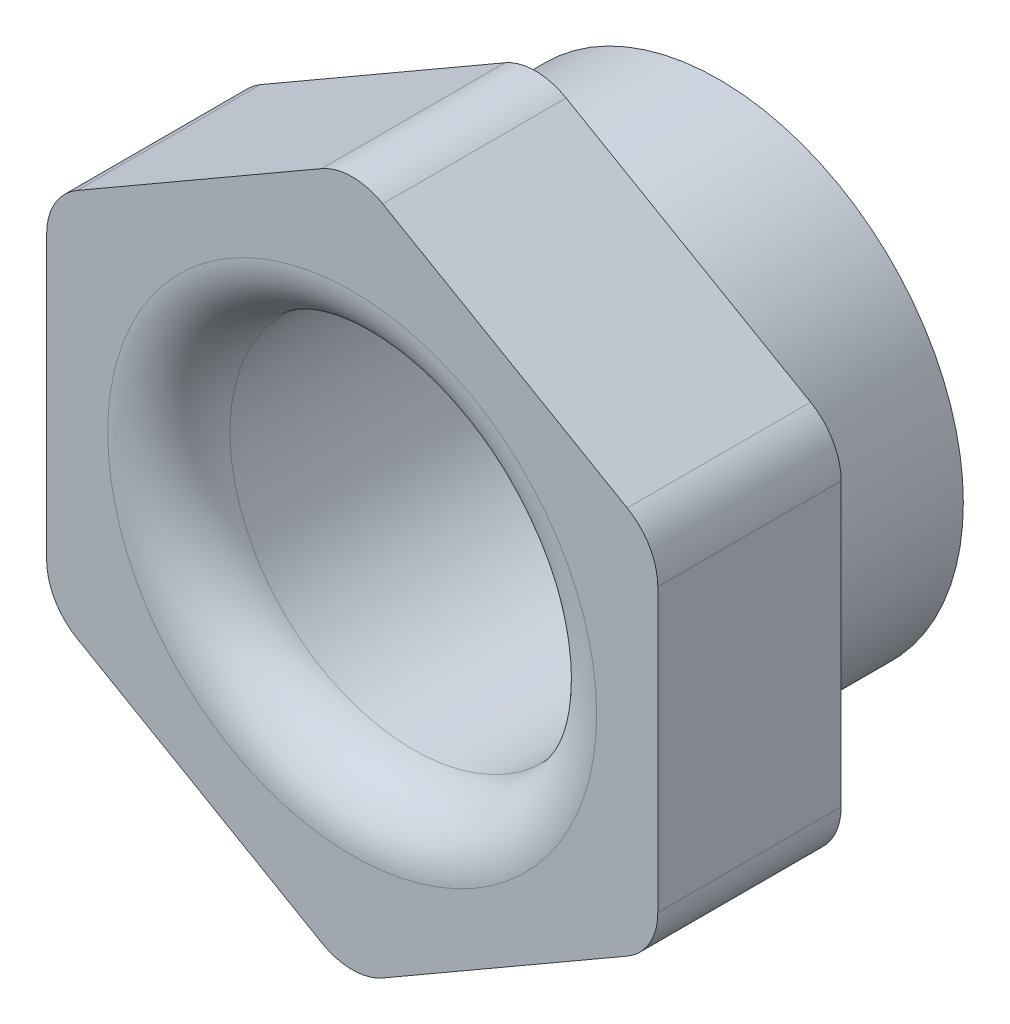
ISO-10303-21;
HEADER;
FILE_DESCRIPTION(('STEP AP214'),'2;1');
FILE_NAME('part.step','',(''),(''),'','','');
FILE_SCHEMA(('AUTOMOTIVE_DESIGN { 1 0 10303 214 1 1 1 1 }'));
ENDSEC;
DATA;
#1=APPLICATION_CONTEXT('core data for automotive mechanical design processes');
#2=APPLICATION_PROTOCOL_DEFINITION('international standard','automotive_design',2000,#1);
#3=PRODUCT_CONTEXT('',#1,'mechanical');
#4=PRODUCT('Part','Part','',(#3));
#5=PRODUCT_RELATED_PRODUCT_CATEGORY('part','',(#4));
#6=PRODUCT_DEFINITION_FORMATION('','',#4);
#7=PRODUCT_DEFINITION_CONTEXT('part definition',#1,'design');
#8=PRODUCT_DEFINITION('design','',#6,#7);
#9=PRODUCT_DEFINITION_SHAPE('','',#8);
#10=(LENGTH_UNIT() NAMED_UNIT(*) SI_UNIT(.MILLI.,.METRE.));
#11=(NAMED_UNIT(*) PLANE_ANGLE_UNIT() SI_UNIT($,.RADIAN.));
#12=(NAMED_UNIT(*) SI_UNIT($,.STERADIAN.) SOLID_ANGLE_UNIT());
#13=UNCERTAINTY_MEASURE_WITH_UNIT(LENGTH_MEASURE(1.E-05),#10,'distance_accuracy_value','');
#14=(GEOMETRIC_REPRESENTATION_CONTEXT(3) GLOBAL_UNCERTAINTY_ASSIGNED_CONTEXT((#13)) GLOBAL_UNIT_ASSIGNED_CONTEXT((#10,
#11,#12)) REPRESENTATION_CONTEXT('',''));
#15=CARTESIAN_POINT('',(0.,0.,0.));
#16=DIRECTION('',(0.,0.,1.));
#17=DIRECTION('',(1.,0.,0.));
#18=AXIS2_PLACEMENT_3D('',#15,#16,#17);
#19=CARTESIAN_POINT('',(2.,1.15470053838,2.25));
#20=DIRECTION('',(0.,0.,1.));
#21=DIRECTION('',(1.,0.,0.));
#22=AXIS2_PLACEMENT_3D('',#19,#20,#21);
#23=CYLINDRICAL_SURFACE('',#22,0.5);
#24=CARTESIAN_POINT('',(2.,1.15470053838,1.5));
#25=DIRECTION('',(0.,0.,1.));
#26=DIRECTION('',(1.,0.,0.));
#27=AXIS2_PLACEMENT_3D('',#24,#25,#26);
#28=CIRCLE('',#27,0.5);
#29=CARTESIAN_POINT('',(2.5,1.15470053838,1.5));
#30=VERTEX_POINT('',#29);
#31=CARTESIAN_POINT('',(2.24999999999848,1.58771324026836,1.5));
#32=VERTEX_POINT('',#31);
#33=EDGE_CURVE('E260',#30,#32,#28,.T.);
#34=ORIENTED_EDGE('',*,*,#33,.T.);
#35=DIRECTION('',(0.,0.,1.));
#36=VECTOR('',#35,1.);
#37=CARTESIAN_POINT('',(2.24999999999891,1.58771324026811,1.5));
#38=LINE('',#37,#36);
#39=CARTESIAN_POINT('',(2.24999999999903,1.5877132402693,3.));
#40=VERTEX_POINT('',#39);
#41=EDGE_CURVE('E119',#40,#32,#38,.F.);
#42=ORIENTED_EDGE('',*,*,#41,.F.);
#43=CARTESIAN_POINT('',(2.,1.15470053838,3.));
#44=DIRECTION('',(0.,0.,1.));
#45=DIRECTION('',(1.,0.,0.));
#46=AXIS2_PLACEMENT_3D('',#43,#44,#45);
#47=CIRCLE('',#46,0.5);
#48=CARTESIAN_POINT('',(2.5,1.15470053838,3.));
#49=VERTEX_POINT('',#48);
#50=EDGE_CURVE('E112',#40,#49,#47,.F.);
#51=ORIENTED_EDGE('',*,*,#50,.T.);
#52=DIRECTION('',(0.,0.,-1.));
#53=VECTOR('',#52,1.);
#54=CARTESIAN_POINT('',(2.5,1.15470053838,1.5));
#55=LINE('',#54,#53);
#56=EDGE_CURVE('E117',#30,#49,#55,.F.);
#57=ORIENTED_EDGE('',*,*,#56,.F.);
#58=EDGE_LOOP('',(#34,#42,#51,#57));
#59=FACE_BOUND('',#58,.T.);
#60=ADVANCED_FACE('F17',(#59),#23,.T.);
#61=CARTESIAN_POINT('',(0.,2.30940107676,2.25));
#62=DIRECTION('',(0.,0.,1.));
#63=DIRECTION('',(1.,0.,0.));
#64=AXIS2_PLACEMENT_3D('',#61,#62,#63);
#65=CYLINDRICAL_SURFACE('',#64,0.5);
#66=CARTESIAN_POINT('',(0.,2.30940107676,1.5));
#67=DIRECTION('',(0.,0.,1.));
#68=DIRECTION('',(1.,0.,0.));
#69=AXIS2_PLACEMENT_3D('',#66,#67,#68);
#70=CIRCLE('',#69,0.5);
#71=CARTESIAN_POINT('',(0.249999999998405,2.74241377864824,1.5));
#72=VERTEX_POINT('',#71);
#73=CARTESIAN_POINT('',(-0.250000000000659,2.74241377865214,1.5));
#74=VERTEX_POINT('',#73);
#75=EDGE_CURVE('E258',#72,#74,#70,.T.);
#76=ORIENTED_EDGE('',*,*,#75,.T.);
#77=DIRECTION('',(0.,0.,1.));
#78=VECTOR('',#77,1.);
#79=CARTESIAN_POINT('',(-0.250000000001091,2.74241377865189,1.5));
#80=LINE('',#79,#78);
#81=CARTESIAN_POINT('',(-0.250000000000126,2.74241377865119,3.));
#82=VERTEX_POINT('',#81);
#83=EDGE_CURVE('E212',#82,#74,#80,.F.);
#84=ORIENTED_EDGE('',*,*,#83,.F.);
#85=CARTESIAN_POINT('',(0.,2.30940107676,3.));
#86=DIRECTION('',(0.,0.,1.));
#87=DIRECTION('',(1.,0.,0.));
#88=AXIS2_PLACEMENT_3D('',#85,#86,#87);
#89=CIRCLE('',#88,0.5);
#90=CARTESIAN_POINT('',(0.249999999998999,2.74241377864924,3.));
#91=VERTEX_POINT('',#90);
#92=EDGE_CURVE('E121',#82,#91,#89,.F.);
#93=ORIENTED_EDGE('',*,*,#92,.T.);
#94=DIRECTION('',(0.,0.,1.));
#95=VECTOR('',#94,1.);
#96=CARTESIAN_POINT('',(0.249999999998838,2.74241377864799,1.5));
#97=LINE('',#96,#95);
#98=EDGE_CURVE('E225',#72,#91,#97,.T.);
#99=ORIENTED_EDGE('',*,*,#98,.F.);
#100=EDGE_LOOP('',(#76,#84,#93,#99));
#101=FACE_BOUND('',#100,.T.);
#102=ADVANCED_FACE('F333',(#101),#65,.T.);
#103=CARTESIAN_POINT('',(-2.,1.15470053838,2.25));
#104=DIRECTION('',(0.,0.,1.));
#105=DIRECTION('',(1.,0.,0.));
#106=AXIS2_PLACEMENT_3D('',#103,#104,#105);
#107=CYLINDRICAL_SURFACE('',#106,0.5);
#108=CARTESIAN_POINT('',(-2.,1.15470053838,1.5));
#109=DIRECTION('',(0.,0.,1.));
#110=DIRECTION('',(1.,0.,0.));
#111=AXIS2_PLACEMENT_3D('',#108,#109,#110);
#112=CIRCLE('',#111,0.5);
#113=CARTESIAN_POINT('',(-2.25000000000073,1.58771324027226,1.5));
#114=VERTEX_POINT('',#113);
#115=CARTESIAN_POINT('',(-2.5,1.15470053838,1.5));
#116=VERTEX_POINT('',#115);
#117=EDGE_CURVE('E256',#114,#116,#112,.T.);
#118=ORIENTED_EDGE('',*,*,#117,.T.);
#119=DIRECTION('',(0.,0.,1.));
#120=VECTOR('',#119,1.);
#121=CARTESIAN_POINT('',(-2.5,1.15470053838,1.5));
#122=LINE('',#121,#120);
#123=CARTESIAN_POINT('',(-2.5,1.15470053838,3.));
#124=VERTEX_POINT('',#123);
#125=EDGE_CURVE('E237',#124,#116,#122,.F.);
#126=ORIENTED_EDGE('',*,*,#125,.F.);
#127=CARTESIAN_POINT('',(-2.,1.15470053838,3.));
#128=DIRECTION('',(0.,0.,1.));
#129=DIRECTION('',(1.,0.,0.));
#130=AXIS2_PLACEMENT_3D('',#127,#128,#129);
#131=CIRCLE('',#130,0.5);
#132=CARTESIAN_POINT('',(-2.25000000000016,1.58771324027125,3.));
#133=VERTEX_POINT('',#132);
#134=EDGE_CURVE('E204',#124,#133,#131,.F.);
#135=ORIENTED_EDGE('',*,*,#134,.T.);
#136=DIRECTION('',(0.,0.,1.));
#137=VECTOR('',#136,1.);
#138=CARTESIAN_POINT('',(-2.25000000000116,1.58771324027201,1.5));
#139=LINE('',#138,#137);
#140=EDGE_CURVE('E215',#114,#133,#139,.T.);
#141=ORIENTED_EDGE('',*,*,#140,.F.);
#142=EDGE_LOOP('',(#118,#126,#135,#141));
#143=FACE_BOUND('',#142,.T.);
#144=ADVANCED_FACE('F329',(#143),#107,.T.);
#145=CARTESIAN_POINT('',(-2.,-1.15470053838,2.25));
#146=DIRECTION('',(0.,0.,1.));
#147=DIRECTION('',(1.,0.,0.));
#148=AXIS2_PLACEMENT_3D('',#145,#146,#147);
#149=CYLINDRICAL_SURFACE('',#148,0.5);
#150=CARTESIAN_POINT('',(-2.,-1.15470053838,1.5));
#151=DIRECTION('',(0.,0.,1.));
#152=DIRECTION('',(1.,0.,0.));
#153=AXIS2_PLACEMENT_3D('',#150,#151,#152);
#154=CIRCLE('',#153,0.5);
#155=CARTESIAN_POINT('',(-2.5,-1.15470053838,1.5));
#156=VERTEX_POINT('',#155);
#157=CARTESIAN_POINT('',(-2.24999999999848,-1.58771324026836,1.5));
#158=VERTEX_POINT('',#157);
#159=EDGE_CURVE('E254',#156,#158,#154,.T.);
#160=ORIENTED_EDGE('',*,*,#159,.T.);
#161=DIRECTION('',(0.,0.,1.));
#162=VECTOR('',#161,1.);
#163=CARTESIAN_POINT('',(-2.24999999999891,-1.58771324026811,1.5));
#164=LINE('',#163,#162);
#165=CARTESIAN_POINT('',(-2.24999999999903,-1.5877132402693,3.));
#166=VERTEX_POINT('',#165);
#167=EDGE_CURVE('E301',#166,#158,#164,.F.);
#168=ORIENTED_EDGE('',*,*,#167,.F.);
#169=CARTESIAN_POINT('',(-2.,-1.15470053838,3.));
#170=DIRECTION('',(0.,0.,1.));
#171=DIRECTION('',(1.,0.,0.));
#172=AXIS2_PLACEMENT_3D('',#169,#170,#171);
#173=CIRCLE('',#172,0.5);
#174=CARTESIAN_POINT('',(-2.5,-1.15470053838,3.));
#175=VERTEX_POINT('',#174);
#176=EDGE_CURVE('E265',#166,#175,#173,.F.);
#177=ORIENTED_EDGE('',*,*,#176,.T.);
#178=DIRECTION('',(0.,0.,1.));
#179=VECTOR('',#178,1.);
#180=CARTESIAN_POINT('',(-2.5,-1.15470053838,1.5));
#181=LINE('',#180,#179);
#182=EDGE_CURVE('E239',#156,#175,#181,.T.);
#183=ORIENTED_EDGE('',*,*,#182,.F.);
#184=EDGE_LOOP('',(#160,#168,#177,#183));
#185=FACE_BOUND('',#184,.T.);
#186=ADVANCED_FACE('F316',(#185),#149,.T.);
#187=CARTESIAN_POINT('',(0.,-2.30940107676,2.25));
#188=DIRECTION('',(0.,0.,1.));
#189=DIRECTION('',(1.,0.,0.));
#190=AXIS2_PLACEMENT_3D('',#187,#188,#189);
#191=CYLINDRICAL_SURFACE('',#190,0.5);
#192=CARTESIAN_POINT('',(0.,-2.30940107676,1.5));
#193=DIRECTION('',(0.,0.,1.));
#194=DIRECTION('',(1.,0.,0.));
#195=AXIS2_PLACEMENT_3D('',#192,#193,#194);
#196=CIRCLE('',#195,0.5);
#197=CARTESIAN_POINT('',(-0.249999999998405,-2.74241377864824,1.5));
#198=VERTEX_POINT('',#197);
#199=CARTESIAN_POINT('',(0.250000000000659,-2.74241377865214,1.5));
#200=VERTEX_POINT('',#199);
#201=EDGE_CURVE('E251',#198,#200,#196,.T.);
#202=ORIENTED_EDGE('',*,*,#201,.T.);
#203=DIRECTION('',(0.,0.,1.));
#204=VECTOR('',#203,1.);
#205=CARTESIAN_POINT('',(0.250000000001092,-2.74241377865189,1.5));
#206=LINE('',#205,#204);
#207=CARTESIAN_POINT('',(0.250000000000126,-2.74241377865119,3.));
#208=VERTEX_POINT('',#207);
#209=EDGE_CURVE('E153',#208,#200,#206,.F.);
#210=ORIENTED_EDGE('',*,*,#209,.F.);
#211=CARTESIAN_POINT('',(0.,-2.30940107676,3.));
#212=DIRECTION('',(0.,0.,1.));
#213=DIRECTION('',(1.,0.,0.));
#214=AXIS2_PLACEMENT_3D('',#211,#212,#213);
#215=CIRCLE('',#214,0.5);
#216=CARTESIAN_POINT('',(-0.249999999998999,-2.74241377864924,3.));
#217=VERTEX_POINT('',#216);
#218=EDGE_CURVE('E263',#208,#217,#215,.F.);
#219=ORIENTED_EDGE('',*,*,#218,.T.);
#220=DIRECTION('',(0.,0.,1.));
#221=VECTOR('',#220,1.);
#222=CARTESIAN_POINT('',(-0.249999999998838,-2.74241377864799,1.5));
#223=LINE('',#222,#221);
#224=EDGE_CURVE('E236',#198,#217,#223,.T.);
#225=ORIENTED_EDGE('',*,*,#224,.F.);
#226=EDGE_LOOP('',(#202,#210,#219,#225));
#227=FACE_BOUND('',#226,.T.);
#228=ADVANCED_FACE('F321',(#227),#191,.T.);
#229=CARTESIAN_POINT('',(2.,-1.15470053838,2.25));
#230=DIRECTION('',(0.,0.,1.));
#231=DIRECTION('',(1.,0.,0.));
#232=AXIS2_PLACEMENT_3D('',#229,#230,#231);
#233=CYLINDRICAL_SURFACE('',#232,0.5);
#234=CARTESIAN_POINT('',(2.,-1.15470053838,1.5));
#235=DIRECTION('',(0.,0.,1.));
#236=DIRECTION('',(1.,0.,0.));
#237=AXIS2_PLACEMENT_3D('',#234,#235,#236);
#238=CIRCLE('',#237,0.5);
#239=CARTESIAN_POINT('',(2.25000000000073,-1.58771324027226,1.5));
#240=VERTEX_POINT('',#239);
#241=CARTESIAN_POINT('',(2.5,-1.15470053838,1.5));
#242=VERTEX_POINT('',#241);
#243=EDGE_CURVE('E244',#240,#242,#238,.T.);
#244=ORIENTED_EDGE('',*,*,#243,.T.);
#245=DIRECTION('',(0.,0.,-1.));
#246=VECTOR('',#245,1.);
#247=CARTESIAN_POINT('',(2.5,-1.15470053838,1.5));
#248=LINE('',#247,#246);
#249=CARTESIAN_POINT('',(2.5,-1.15470053838,3.));
#250=VERTEX_POINT('',#249);
#251=EDGE_CURVE('E131',#250,#242,#248,.T.);
#252=ORIENTED_EDGE('',*,*,#251,.F.);
#253=CARTESIAN_POINT('',(2.,-1.15470053838,3.));
#254=DIRECTION('',(0.,0.,1.));
#255=DIRECTION('',(1.,0.,0.));
#256=AXIS2_PLACEMENT_3D('',#253,#254,#255);
#257=CIRCLE('',#256,0.5);
#258=CARTESIAN_POINT('',(2.25000000000016,-1.58771324027125,3.));
#259=VERTEX_POINT('',#258);
#260=EDGE_CURVE('E135',#250,#259,#257,.F.);
#261=ORIENTED_EDGE('',*,*,#260,.T.);
#262=DIRECTION('',(0.,0.,1.));
#263=VECTOR('',#262,1.);
#264=CARTESIAN_POINT('',(2.25000000000116,-1.58771324027201,1.5));
#265=LINE('',#264,#263);
#266=EDGE_CURVE('E143',#240,#259,#265,.T.);
#267=ORIENTED_EDGE('',*,*,#266,.F.);
#268=EDGE_LOOP('',(#244,#252,#261,#267));
#269=FACE_BOUND('',#268,.T.);
#270=ADVANCED_FACE('F290',(#269),#233,.T.);
#271=CARTESIAN_POINT('',(0.,0.,1.5));
#272=DIRECTION('',(0.,0.,1.));
#273=DIRECTION('',(1.,0.,0.));
#274=AXIS2_PLACEMENT_3D('',#271,#272,#273);
#275=PLANE('',#274);
#276=CARTESIAN_POINT('',(0.,0.,1.5));
#277=DIRECTION('',(0.,0.,1.));
#278=DIRECTION('',(1.,0.,0.));
#279=AXIS2_PLACEMENT_3D('',#276,#277,#278);
#280=CIRCLE('',#279,2.);
#281=CARTESIAN_POINT('',(2.,0.,1.5));
#282=VERTEX_POINT('',#281);
#283=EDGE_CURVE('E138',#282,#282,#280,.F.);
#284=ORIENTED_EDGE('',*,*,#283,.F.);
#285=EDGE_LOOP('',(#284));
#286=FACE_BOUND('',#285,.T.);
#287=DIRECTION('',(0.866025403784329,0.50000000000019,0.));
#288=VECTOR('',#287,1.);
#289=CARTESIAN_POINT('',(0.,-2.88675134595,1.5));
#290=LINE('',#289,#288);
#291=EDGE_CURVE('E230',#200,#240,#290,.T.);
#292=ORIENTED_EDGE('',*,*,#291,.F.);
#293=ORIENTED_EDGE('',*,*,#201,.F.);
#294=DIRECTION('',(0.866025403784329,-0.50000000000019,0.));
#295=VECTOR('',#294,1.);
#296=CARTESIAN_POINT('',(-2.5,-1.44337567297,1.5));
#297=LINE('',#296,#295);
#298=EDGE_CURVE('E233',#158,#198,#297,.T.);
#299=ORIENTED_EDGE('',*,*,#298,.F.);
#300=ORIENTED_EDGE('',*,*,#159,.F.);
#301=DIRECTION('',(0.,-1.,0.));
#302=VECTOR('',#301,1.);
#303=CARTESIAN_POINT('',(-2.5,1.44337567297,1.5));
#304=LINE('',#303,#302);
#305=EDGE_CURVE('E219',#116,#156,#304,.T.);
#306=ORIENTED_EDGE('',*,*,#305,.F.);
#307=ORIENTED_EDGE('',*,*,#117,.F.);
#308=DIRECTION('',(-0.866025403784329,-0.50000000000019,0.));
#309=VECTOR('',#308,1.);
#310=CARTESIAN_POINT('',(0.,2.88675134595,1.5));
#311=LINE('',#310,#309);
#312=EDGE_CURVE('E216',#74,#114,#311,.T.);
#313=ORIENTED_EDGE('',*,*,#312,.F.);
#314=ORIENTED_EDGE('',*,*,#75,.F.);
#315=DIRECTION('',(-0.866025403784329,0.50000000000019,0.));
#316=VECTOR('',#315,1.);
#317=CARTESIAN_POINT('',(2.5,1.44337567297,1.5));
#318=LINE('',#317,#316);
#319=EDGE_CURVE('E228',#32,#72,#318,.T.);
#320=ORIENTED_EDGE('',*,*,#319,.F.);
#321=ORIENTED_EDGE('',*,*,#33,.F.);
#322=DIRECTION('',(0.,1.,0.));
#323=VECTOR('',#322,1.);
#324=CARTESIAN_POINT('',(2.5,-1.44337567297,1.5));
#325=LINE('',#324,#323);
#326=EDGE_CURVE('E130',#242,#30,#325,.T.);
#327=ORIENTED_EDGE('',*,*,#326,.F.);
#328=ORIENTED_EDGE('',*,*,#243,.F.);
#329=EDGE_LOOP('',(#292,#293,#299,#300,#306,#307,#313,#314,#320,#321,#327,#328));
#330=FACE_BOUND('',#329,.T.);
#331=ADVANCED_FACE('F287',(#286,#330),#275,.F.);
#332=CARTESIAN_POINT('',(2.5,-1.44337567297,1.5));
#333=DIRECTION('',(1.,0.,0.));
#334=DIRECTION('',(0.,0.,-1.));
#335=AXIS2_PLACEMENT_3D('',#332,#333,#334);
#336=PLANE('',#335);
#337=DIRECTION('',(0.,1.,0.));
#338=VECTOR('',#337,1.);
#339=CARTESIAN_POINT('',(2.5,0.,3.));
#340=LINE('',#339,#338);
#341=EDGE_CURVE('E128',#250,#49,#340,.T.);
#342=ORIENTED_EDGE('',*,*,#341,.F.);
#343=ORIENTED_EDGE('',*,*,#251,.T.);
#344=ORIENTED_EDGE('',*,*,#326,.T.);
#345=ORIENTED_EDGE('',*,*,#56,.T.);
#346=EDGE_LOOP('',(#342,#343,#344,#345));
#347=FACE_BOUND('',#346,.T.);
#348=ADVANCED_FACE('F126',(#347),#336,.T.);
#349=CARTESIAN_POINT('',(2.5,1.44337567297,1.5));
#350=DIRECTION('',(0.50000000000019,0.866025403784329,0.));
#351=DIRECTION('',(-0.866025403784329,0.50000000000019,0.));
#352=AXIS2_PLACEMENT_3D('',#349,#350,#351);
#353=PLANE('',#352);
#354=DIRECTION('',(-0.866025403784298,0.500000000000243,0.));
#355=VECTOR('',#354,1.);
#356=CARTESIAN_POINT('',(2.25,1.58771324027,3.));
#357=LINE('',#356,#355);
#358=EDGE_CURVE('E137',#40,#91,#357,.T.);
#359=ORIENTED_EDGE('',*,*,#358,.F.);
#360=ORIENTED_EDGE('',*,*,#41,.T.);
#361=ORIENTED_EDGE('',*,*,#319,.T.);
#362=ORIENTED_EDGE('',*,*,#98,.T.);
#363=EDGE_LOOP('',(#359,#360,#361,#362));
#364=FACE_BOUND('',#363,.T.);
#365=ADVANCED_FACE('F342',(#364),#353,.T.);
#366=CARTESIAN_POINT('',(0.,2.88675134595,1.5));
#367=DIRECTION('',(-0.50000000000019,0.866025403784329,0.));
#368=DIRECTION('',(-0.866025403784329,-0.50000000000019,0.));
#369=AXIS2_PLACEMENT_3D('',#366,#367,#368);
#370=PLANE('',#369);
#371=DIRECTION('',(-0.866025403784298,-0.500000000000243,0.));
#372=VECTOR('',#371,1.);
#373=CARTESIAN_POINT('',(-0.25,2.74241377865,3.));
#374=LINE('',#373,#372);
#375=EDGE_CURVE('E140',#82,#133,#374,.T.);
#376=ORIENTED_EDGE('',*,*,#375,.F.);
#377=ORIENTED_EDGE('',*,*,#83,.T.);
#378=ORIENTED_EDGE('',*,*,#312,.T.);
#379=ORIENTED_EDGE('',*,*,#140,.T.);
#380=EDGE_LOOP('',(#376,#377,#378,#379));
#381=FACE_BOUND('',#380,.T.);
#382=ADVANCED_FACE('F210',(#381),#370,.T.);
#383=CARTESIAN_POINT('',(-2.5,1.44337567297,1.5));
#384=DIRECTION('',(-1.,0.,0.));
#385=DIRECTION('',(0.,-1.,0.));
#386=AXIS2_PLACEMENT_3D('',#383,#384,#385);
#387=PLANE('',#386);
#388=DIRECTION('',(0.,1.,0.));
#389=VECTOR('',#388,1.);
#390=CARTESIAN_POINT('',(-2.5,0.,3.));
#391=LINE('',#390,#389);
#392=EDGE_CURVE('E200',#124,#175,#391,.F.);
#393=ORIENTED_EDGE('',*,*,#392,.F.);
#394=ORIENTED_EDGE('',*,*,#125,.T.);
#395=ORIENTED_EDGE('',*,*,#305,.T.);
#396=ORIENTED_EDGE('',*,*,#182,.T.);
#397=EDGE_LOOP('',(#393,#394,#395,#396));
#398=FACE_BOUND('',#397,.T.);
#399=ADVANCED_FACE('F311',(#398),#387,.T.);
#400=CARTESIAN_POINT('',(-2.5,-1.44337567297,1.5));
#401=DIRECTION('',(-0.50000000000019,-0.866025403784329,0.));
#402=DIRECTION('',(0.866025403784329,-0.50000000000019,0.));
#403=AXIS2_PLACEMENT_3D('',#400,#401,#402);
#404=PLANE('',#403);
#405=DIRECTION('',(0.866025403784298,-0.500000000000243,0.));
#406=VECTOR('',#405,1.);
#407=CARTESIAN_POINT('',(-2.25,-1.58771324027,3.));
#408=LINE('',#407,#406);
#409=EDGE_CURVE('E197',#166,#217,#408,.T.);
#410=ORIENTED_EDGE('',*,*,#409,.F.);
#411=ORIENTED_EDGE('',*,*,#167,.T.);
#412=ORIENTED_EDGE('',*,*,#298,.T.);
#413=ORIENTED_EDGE('',*,*,#224,.T.);
#414=EDGE_LOOP('',(#410,#411,#412,#413));
#415=FACE_BOUND('',#414,.T.);
#416=ADVANCED_FACE('F318',(#415),#404,.T.);
#417=CARTESIAN_POINT('',(0.,-2.88675134595,1.5));
#418=DIRECTION('',(0.50000000000019,-0.866025403784329,0.));
#419=DIRECTION('',(0.866025403784329,0.50000000000019,0.));
#420=AXIS2_PLACEMENT_3D('',#417,#418,#419);
#421=PLANE('',#420);
#422=ORIENTED_EDGE('',*,*,#291,.T.);
#423=ORIENTED_EDGE('',*,*,#266,.T.);
#424=DIRECTION('',(0.866025403784298,0.500000000000243,0.));
#425=VECTOR('',#424,1.);
#426=CARTESIAN_POINT('',(0.25,-2.74241377865,3.));
#427=LINE('',#426,#425);
#428=EDGE_CURVE('E190',#208,#259,#427,.T.);
#429=ORIENTED_EDGE('',*,*,#428,.F.);
#430=ORIENTED_EDGE('',*,*,#209,.T.);
#431=EDGE_LOOP('',(#422,#423,#429,#430));
#432=FACE_BOUND('',#431,.T.);
#433=ADVANCED_FACE('F284',(#432),#421,.T.);
#434=CARTESIAN_POINT('',(0.,0.,0.75));
#435=DIRECTION('',(0.,0.,1.));
#436=DIRECTION('',(1.,0.,0.));
#437=AXIS2_PLACEMENT_3D('',#434,#435,#436);
#438=CYLINDRICAL_SURFACE('',#437,2.);
#439=CARTESIAN_POINT('',(0.,0.,0.));
#440=DIRECTION('',(0.,0.,1.));
#441=DIRECTION('',(1.,0.,0.));
#442=AXIS2_PLACEMENT_3D('',#439,#440,#441);
#443=CIRCLE('',#442,2.);
#444=CARTESIAN_POINT('',(2.,0.,0.));
#445=VERTEX_POINT('',#444);
#446=EDGE_CURVE('E247',#445,#445,#443,.T.);
#447=ORIENTED_EDGE('',*,*,#446,.T.);
#448=EDGE_LOOP('',(#447));
#449=FACE_BOUND('',#448,.T.);
#450=ORIENTED_EDGE('',*,*,#283,.T.);
#451=EDGE_LOOP('',(#450));
#452=FACE_BOUND('',#451,.T.);
#453=ADVANCED_FACE('F184',(#449,#452),#438,.T.);
#454=CARTESIAN_POINT('',(0.,0.,3.));
#455=DIRECTION('',(0.,0.,1.));
#456=DIRECTION('',(1.,0.,0.));
#457=AXIS2_PLACEMENT_3D('',#454,#455,#456);
#458=PLANE('',#457);
#459=CARTESIAN_POINT('',(0.,0.,3.));
#460=DIRECTION('',(0.,0.,1.));
#461=DIRECTION('',(-1.,0.,0.));
#462=AXIS2_PLACEMENT_3D('',#459,#460,#461);
#463=CIRCLE('',#462,2.);
#464=CARTESIAN_POINT('',(-2.,0.,3.));
#465=VERTEX_POINT('',#464);
#466=CARTESIAN_POINT('',(2.,0.,3.));
#467=VERTEX_POINT('',#466);
#468=EDGE_CURVE('E149',#465,#467,#463,.T.);
#469=ORIENTED_EDGE('',*,*,#468,.F.);
#470=CARTESIAN_POINT('',(2.,0.,3.));
#471=CARTESIAN_POINT('',(2.00000054477177,0.0307999523829421,3.));
#472=CARTESIAN_POINT('',(1.99928854273988,0.0615998611419067,3.));
#473=CARTESIAN_POINT('',(1.99644335646961,0.123133973441051,3.));
#474=CARTESIAN_POINT('',(1.99431017223124,0.15386817698123,3.));
#475=CARTESIAN_POINT('',(1.9886265329489,0.215205260871976,3.));
#476=CARTESIAN_POINT('',(1.98507607790492,0.245808141222542,3.));
#477=CARTESIAN_POINT('',(1.9765656455959,0.306817278584984,3.));
#478=CARTESIAN_POINT('',(1.97160566833085,0.337223535596859,3.));
#479=CARTESIAN_POINT('',(1.96028673040476,0.397774535669419,3.));
#480=CARTESIAN_POINT('',(1.95392776974372,0.427919278730103,3.));
#481=CARTESIAN_POINT('',(1.93982444769905,0.48788292107043,3.));
#482=CARTESIAN_POINT('',(1.93208008631542,0.517701820350073,3.));
#483=CARTESIAN_POINT('',(1.91522248637586,0.576950139938256,3.));
#484=CARTESIAN_POINT('',(1.90610924781993,0.606379560246797,3.));
#485=CARTESIAN_POINT('',(1.88653334254393,0.664786118080808,3.));
#486=CARTESIAN_POINT('',(1.87607067582385,0.693763255606278,3.));
#487=CARTESIAN_POINT('',(1.85381824179358,0.751203409142332,3.));
#488=CARTESIAN_POINT('',(1.84202847448338,0.779666425152914,3.));
#489=CARTESIAN_POINT('',(1.8171469994687,0.836017594334664,3.));
#490=CARTESIAN_POINT('',(1.80405529176421,0.863905747505832,3.00000000000001));
#491=CARTESIAN_POINT('',(1.77659787365604,0.91904767560032,2.99999999999999));
#492=CARTESIAN_POINT('',(1.76223216325237,0.946301450523641,2.99999999999997));
#493=CARTESIAN_POINT('',(1.73225739933311,1.00011646374378,3.00000000000003));
#494=CARTESIAN_POINT('',(1.71664834581752,1.0266777020406,3.00000000000012));
#495=CARTESIAN_POINT('',(1.68422019710094,1.07905094946882,2.99999999999988));
#496=CARTESIAN_POINT('',(1.66740110189994,1.10486295860021,2.99999999999955));
#497=CARTESIAN_POINT('',(1.63258879649327,1.15568269909016,3.00000000000045));
#498=CARTESIAN_POINT('',(1.61459558628758,1.18069043044871,3.00000000000168));
#499=CARTESIAN_POINT('',(1.57747332283338,1.22984811506831,2.99999999999832));
#500=CARTESIAN_POINT('',(1.55834426958486,1.25399806832935,2.99999999999372));
#501=CARTESIAN_POINT('',(1.51899161434665,1.3013891542785,3.00000000000628));
#502=CARTESIAN_POINT('',(1.49876801235696,1.32463028696661,3.00000000002343));
#503=CARTESIAN_POINT('',(1.45726765652568,1.37015228761962,2.99999999997657));
#504=CARTESIAN_POINT('',(1.43599090268409,1.39243315558452,2.99999999991255));
#505=CARTESIAN_POINT('',(1.39154812574104,1.43688219053599,3.00000000009102));
#506=CARTESIAN_POINT('',(1.36834044154374,1.45900870685418,3.00000000034611));
#507=CARTESIAN_POINT('',(1.32090016349107,1.502135417049,2.99999999846833));
#508=CARTESIAN_POINT('',(1.29666755335841,1.52313559302571,2.99999999633542));
#509=CARTESIAN_POINT('',(1.2472295229619,1.56395784791455,2.99999998469571));
#510=CARTESIAN_POINT('',(1.22202406334978,1.58377987909243,2.99999997518862));
#511=CARTESIAN_POINT('',(1.16428312103144,1.62701594691432,2.99999992298123));
#512=CARTESIAN_POINT('',(1.13149062191133,1.65008893045521,2.99999987257604));
#513=CARTESIAN_POINT('',(1.07798353109102,1.68536874121376,2.99999976706743));
#514=CARTESIAN_POINT('',(1.05769375637846,1.69822542780194,2.99999972193731));
#515=CARTESIAN_POINT('',(1.0098058579269,1.72733164756286,2.99999965530598));
#516=CARTESIAN_POINT('',(0.982025775016313,1.74328382725843,2.99999964669326));
#517=CARTESIAN_POINT('',(0.925711271084863,1.77378715254384,2.99999968519965));
#518=CARTESIAN_POINT('',(0.89717688768735,1.78833836784421,2.99999973231597));
#519=CARTESIAN_POINT('',(0.839433171664217,1.81603209781865,2.99999985134136));
#520=CARTESIAN_POINT('',(0.810223920741322,1.82917478194128,2.99999992324743));
#521=CARTESIAN_POINT('',(0.765928085472047,1.84772368635542,2.99999998503446));
#522=CARTESIAN_POINT('',(0.75108291669404,1.85371231124553,2.99999999795175));
#523=CARTESIAN_POINT('',(0.731220049312124,1.86153328355075,3.00000000068342));
#524=CARTESIAN_POINT('',(0.726245299092878,1.86347612296595,3.0000000001568));
#525=CARTESIAN_POINT('',(0.694898275438795,1.87558560060263,2.9999999977769));
#526=CARTESIAN_POINT('',(0.66833193741349,1.88525806776991,2.99999999993112));
#527=CARTESIAN_POINT('',(0.613571992343376,1.90388223417136,2.99999999434085));
#528=CARTESIAN_POINT('',(0.585359955164579,1.91277990009206,2.99999998613389));
#529=CARTESIAN_POINT('',(0.544508802280509,1.92467878455085,2.999999968622));
#530=CARTESIAN_POINT('',(0.532014908095514,1.92818693902252,2.99999996251767));
#531=CARTESIAN_POINT('',(0.489994952889585,1.93954164446079,2.99999994100213));
#532=CARTESIAN_POINT('',(0.460314615169522,1.94683020764624,2.99999992418144));
#533=CARTESIAN_POINT('',(0.411889221957917,1.95753459961312,2.99999990535492));
#534=CARTESIAN_POINT('',(0.393235874173727,1.9613751180076,2.99999990015537));
#535=CARTESIAN_POINT('',(0.338249676499774,1.97186750294615,2.99999989279216));
#536=CARTESIAN_POINT('',(0.301770048155321,1.97777112709869,2.99999989806908));
#537=CARTESIAN_POINT('',(0.235866268635622,1.98655387060144,2.9999999166209));
#538=CARTESIAN_POINT('',(0.20649008718452,1.98980173538817,2.99999992808529));
#539=CARTESIAN_POINT('',(0.147622023752923,1.99498051121168,2.99999995401683));
#540=CARTESIAN_POINT('',(0.118130147163823,1.99691148289944,2.99999996848384));
#541=CARTESIAN_POINT('',(0.0590916986373939,1.99944471244328,2.99999999124703));
#542=CARTESIAN_POINT('',(0.0295451304585288,2.00004705844184,2.99999999954363));
#543=CARTESIAN_POINT('',(-0.0295861704265052,1.99995287619115,3.00000000045701));
#544=CARTESIAN_POINT('',(-0.0591708991357395,1.99925454256502,2.99999999305201));
#545=CARTESIAN_POINT('',(-0.118282824290924,1.99659362417123,2.99999998416624));
#546=CARTESIAN_POINT('',(-0.147810023164353,1.99463109395837,2.99999998268521));
#547=CARTESIAN_POINT('',(-0.206748821730132,1.98941981369222,2.99999999664858));
#548=CARTESIAN_POINT('',(-0.236160419758852,1.98617104519645,3.00000001209321));
#549=CARTESIAN_POINT('',(-0.302166156228135,1.97749487412277,2.999999984361));
#550=CARTESIAN_POINT('',(-0.338717304077281,1.97172583154185,2.99999992555998));
#551=CARTESIAN_POINT('',(-0.386208088535129,1.96273048473619,2.99999989022059));
#552=CARTESIAN_POINT('',(-0.397343343697557,1.96051253232992,2.99999988491335));
#553=CARTESIAN_POINT('',(-0.441076006648172,1.95139294185096,2.99999987977738));
#554=CARTESIAN_POINT('',(-0.473519649011576,1.94373110549487,2.99999991040918));
#555=CARTESIAN_POINT('',(-0.523015196371127,1.93073334802969,2.99999994370211));
#556=CARTESIAN_POINT('',(-0.54022100288264,1.92596870057899,2.99999995274664));
#557=CARTESIAN_POINT('',(-0.582791928395419,1.913562452433,2.99999997296319));
#558=CARTESIAN_POINT('',(-0.608077230591174,1.90564421884026,2.99999998304746));
#559=CARTESIAN_POINT('',(-0.660323940870729,1.88813799528476,2.99999999643911));
#560=CARTESIAN_POINT('',(-0.687257634764661,1.87846710546515,2.99999999913988));
#561=CARTESIAN_POINT('',(-0.721395442581468,1.86539155085255,2.99999999997357));
#562=CARTESIAN_POINT('',(-0.728800816445524,1.86250531485362,2.99999999999673));
#563=CARTESIAN_POINT('',(-0.751089314273916,1.85367054458138,3.00000000000659));
#564=CARTESIAN_POINT('',(-0.7659210060956,1.84759174705478,2.99999999993231));
#565=CARTESIAN_POINT('',(-0.810191932997254,1.82882789716138,3.00000000006437));
#566=CARTESIAN_POINT('',(-0.839409206787006,1.81561458100963,3.00000000062557));
#567=CARTESIAN_POINT('',(-0.897184459457307,1.78781946920045,2.99999999746394));
#568=CARTESIAN_POINT('',(-0.925742423442977,1.77323764266378,2.99999999374103));
#569=CARTESIAN_POINT('',(-0.982135594945665,1.7427315157175,2.99999997382325));
#570=CARTESIAN_POINT('',(-1.0099707638591,1.72680714379631,2.99999995762774));
#571=CARTESIAN_POINT('',(-1.05799809313975,1.69780814008922,2.9999998901708));
#572=CARTESIAN_POINT('',(-1.07836183601466,1.68501591590991,2.99999984868445));
#573=CARTESIAN_POINT('',(-1.13198522643879,1.6499453788624,2.9999997310623));
#574=CARTESIAN_POINT('',(-1.16482171729487,1.62701245100927,2.99999965022164));
#575=CARTESIAN_POINT('',(-1.22257313279509,1.58392725171725,2.99999961190313));
#576=CARTESIAN_POINT('',(-1.2477591263409,1.56413590207487,2.99999963299009));
#577=CARTESIAN_POINT('',(-1.29713459348436,1.52334687860833,2.99999972959085));
#578=CARTESIAN_POINT('',(-1.32132415493257,1.50234931152305,2.99999980509983));
#579=CARTESIAN_POINT('',(-1.36856249857346,1.45911896119848,2.99999993353786));
#580=CARTESIAN_POINT('',(-1.39161146815247,1.4368863821401,2.99999998647063));
#581=CARTESIAN_POINT('',(-1.42704388074639,1.40134309589369,3.00000000768009));
#582=CARTESIAN_POINT('',(-1.43973019864898,1.38833076688355,3.00000000266289));
#583=CARTESIAN_POINT('',(-1.46683978987292,1.35976473848726,2.99999999672144));
#584=CARTESIAN_POINT('',(-1.48119887569107,1.34414985627986,2.99999999662167));
#585=CARTESIAN_POINT('',(-1.51468195027752,1.30656627627863,2.99999998530354));
#586=CARTESIAN_POINT('',(-1.53358530633579,1.28440024515287,2.9999999699515));
#587=CARTESIAN_POINT('',(-1.56224239377663,1.24926877056352,2.99999993674262));
#588=CARTESIAN_POINT('',(-1.5723375949999,1.2365803429043,2.99999992301258));
#589=CARTESIAN_POINT('',(-1.59149266164182,1.21188760215537,2.99999989582684));
#590=CARTESIAN_POINT('',(-1.60057454380228,1.19990033627721,2.99999988242336));
#591=CARTESIAN_POINT('',(-1.63122015842765,1.15847494494853,2.9999998394003));
#592=CARTESIAN_POINT('',(-1.65211111621613,1.12853282947988,2.99999981391896));
#593=CARTESIAN_POINT('',(-1.68533497691562,1.07796289947984,2.99999980179369));
#594=CARTESIAN_POINT('',(-1.69815214213199,1.05764999475884,2.99999980485112));
#595=CARTESIAN_POINT('',(-1.72718758062303,1.00972452607237,2.99999982052086));
#596=CARTESIAN_POINT('',(-1.74311587810538,0.981935184494197,2.99999983597775));
#597=CARTESIAN_POINT('',(-1.77360124699781,0.925617782482125,2.99999987739489));
#598=CARTESIAN_POINT('',(-1.78815838801842,0.897089759643259,2.9999999033546));
#599=CARTESIAN_POINT('',(-1.81587109831563,0.839361696706068,2.99999995273522));
#600=CARTESIAN_POINT('',(-1.82902677664191,0.810161709109529,2.99999997615633));
#601=CARTESIAN_POINT('',(-1.84767915225134,0.765910361453865,2.99999999597277));
#602=CARTESIAN_POINT('',(-1.85371641622569,0.751084696159449,3.00000000002573));
#603=CARTESIAN_POINT('',(-1.8649906181943,0.722428205637067,2.99999999997623));
#604=CARTESIAN_POINT('',(-1.87025349368275,0.708607576782272,2.99999999647121));
#605=CARTESIAN_POINT('',(-1.88559604385372,0.666983535145795,2.99999998509005));
#606=CARTESIAN_POINT('',(-1.895230974141,0.639014780835483,2.9999999763472));
#607=CARTESIAN_POINT('',(-1.91329424999795,0.58269164391834,2.9999999720869));
#608=CARTESIAN_POINT('',(-1.92172262411036,0.554337270451234,2.99999997656915));
#609=CARTESIAN_POINT('',(-1.93734016618103,0.497288391984211,3.00000000037514));
#610=CARTESIAN_POINT('',(-1.9445292814216,0.468593872570057,3.00000001969952));
#611=CARTESIAN_POINT('',(-1.9560789321912,0.418139773270272,2.99999997563177));
#612=CARTESIAN_POINT('',(-1.96069736404917,0.396439177548042,2.99999993170421));
#613=CARTESIAN_POINT('',(-1.96958817674381,0.350294184868332,2.99999989300887));
#614=CARTESIAN_POINT('',(-1.97375472460027,0.32582932729269,2.99999990468224));
#615=CARTESIAN_POINT('',(-1.98310932691593,0.26399366629068,2.99999993600082));
#616=CARTESIAN_POINT('',(-1.98770059292924,0.226532132848264,2.99999995663321));
#617=CARTESIAN_POINT('',(-1.99509334719899,0.14770770174539,2.9999999869061));
#618=CARTESIAN_POINT('',(-1.99767410775027,0.106323837594847,2.99999999526432));
#619=CARTESIAN_POINT('',(-1.99966844265012,0.0432750285315801,3.00000000031249));
#620=CARTESIAN_POINT('',(-2.00000613805821,0.0216362684879152,3.00000000066946));
#621=CARTESIAN_POINT('',(-2.,0.,3.));
#622=B_SPLINE_CURVE_WITH_KNOTS('',3,(#470,#471,#472,#473,#474,#475,#476,#477,#478,#479,#480,
#481,#482,#483,#484,#485,#486,#487,#488,#489,#490,#491,#492,#493,#494,#495,#496,#497,#498,#499,
#500,#501,#502,#503,#504,#505,#506,#507,#508,#509,#510,#511,#512,#513,#514,#515,#516,#517,#518,
#519,#520,#521,#522,#523,#524,#525,#526,#527,#528,#529,#530,#531,#532,#533,#534,#535,#536,#537,
#538,#539,#540,#541,#542,#543,#544,#545,#546,#547,#548,#549,#550,#551,#552,#553,#554,#555,#556,
#557,#558,#559,#560,#561,#562,#563,#564,#565,#566,#567,#568,#569,#570,#571,#572,#573,#574,#575,
#576,#577,#578,#579,#580,#581,#582,#583,#584,#585,#586,#587,#588,#589,#590,#591,#592,#593,#594,
#595,#596,#597,#598,#599,#600,#601,#602,#603,#604,#605,#606,#607,#608,#609,#610,#611,#612,#613,
#614,#615,#616,#617,#618,#619,#620,#621),.UNSPECIFIED.,.F.,.F.,(4,2,2,2,2,2,2,2,2,2,2,2,2,2,2,2,
2,2,2,2,2,2,2,2,2,2,2,2,2,2,2,2,2,2,2,2,2,2,2,2,2,2,2,2,2,2,2,2,2,2,2,2,2,2,2,2,2,2,2,2,2,2,2,2,
2,2,2,2,2,2,2,2,2,2,2,4),(0.,0.0923915666120051,0.184783133224008,0.277174699836012,
0.369566266448017,0.461957833060022,0.554349399672026,0.646740966284031,0.739132532896035,
0.83152409950804,0.923915666120044,1.01630723273205,1.10869879934405,1.20109036595606,
1.29348193256806,1.38587349918007,1.47826506579207,1.57065663240407,1.66681599660903,
1.76297688853695,1.8591416739114,1.97935035696527,2.05139772931797,2.14745785354606,
2.24351319544997,2.33955696874044,2.38757607908903,2.40359815289815,2.48838916173004,
2.5771021633059,2.61603222579486,2.707678275504,2.76480685116251,2.87560293838799,
2.96424157212972,3.05287612324476,3.14150479406951,3.23025657546293,3.31900452714188,
3.40775375136373,3.51869500896007,3.55275616071164,3.65271009589845,3.70626586425894,
3.78573228641169,3.8715552417526,3.89539883055688,3.94348193756095,4.03964116518086,
4.13580256307213,4.2319690863041,4.30410208064715,4.42417084016761,4.52023080780801,
4.61628228810261,4.71231793547836,4.76683358871778,4.83046316620318,4.91782846184338,
4.96646738735075,5.01158201306724,5.12104388847254,5.19308695388127,5.28913805640518,
5.38518427999906,5.4812230246418,5.52924232272802,5.57360563405556,5.66232190451814,
5.75103607593037,5.83975402028562,5.90630072117917,5.980731947725,6.0938974537938,
6.21820509899526,6.28311701782629),.UNSPECIFIED.);
#623=EDGE_CURVE('E36',#465,#467,#622,.F.);
#624=ORIENTED_EDGE('',*,*,#623,.T.);
#625=EDGE_LOOP('',(#469,#624));
#626=FACE_BOUND('',#625,.T.);
#627=ORIENTED_EDGE('',*,*,#428,.T.);
#628=ORIENTED_EDGE('',*,*,#260,.F.);
#629=ORIENTED_EDGE('',*,*,#341,.T.);
#630=ORIENTED_EDGE('',*,*,#50,.F.);
#631=ORIENTED_EDGE('',*,*,#358,.T.);
#632=ORIENTED_EDGE('',*,*,#92,.F.);
#633=ORIENTED_EDGE('',*,*,#375,.T.);
#634=ORIENTED_EDGE('',*,*,#134,.F.);
#635=ORIENTED_EDGE('',*,*,#392,.T.);
#636=ORIENTED_EDGE('',*,*,#176,.F.);
#637=ORIENTED_EDGE('',*,*,#409,.T.);
#638=ORIENTED_EDGE('',*,*,#218,.F.);
#639=EDGE_LOOP('',(#627,#628,#629,#630,#631,#632,#633,#634,#635,#636,#637,#638));
#640=FACE_BOUND('',#639,.T.);
#641=ADVANCED_FACE('F134',(#626,#640),#458,.T.);
#642=CARTESIAN_POINT('',(0.,0.,0.));
#643=DIRECTION('',(0.,0.,1.));
#644=DIRECTION('',(1.,0.,0.));
#645=AXIS2_PLACEMENT_3D('',#642,#643,#644);
#646=PLANE('',#645);
#647=CARTESIAN_POINT('',(0.,0.,0.));
#648=DIRECTION('',(0.,0.,1.));
#649=DIRECTION('',(1.,0.,0.));
#650=AXIS2_PLACEMENT_3D('',#647,#648,#649);
#651=CIRCLE('',#650,1.5);
#652=CARTESIAN_POINT('',(1.5,0.,0.));
#653=VERTEX_POINT('',#652);
#654=EDGE_CURVE('E28',#653,#653,#651,.T.);
#655=ORIENTED_EDGE('',*,*,#654,.T.);
#656=EDGE_LOOP('',(#655));
#657=FACE_BOUND('',#656,.T.);
#658=ORIENTED_EDGE('',*,*,#446,.F.);
#659=EDGE_LOOP('',(#658));
#660=FACE_BOUND('',#659,.T.);
#661=ADVANCED_FACE('F167',(#657,#660),#646,.F.);
#662=CARTESIAN_POINT('',(0.,0.,2.5));
#663=DIRECTION('',(0.,0.,1.));
#664=DIRECTION('',(-1.,0.,0.));
#665=AXIS2_PLACEMENT_3D('',#662,#663,#664);
#666=TOROIDAL_SURFACE('',#665,2.,0.5);
#667=ORIENTED_EDGE('',*,*,#468,.T.);
#668=ORIENTED_EDGE('',*,*,#623,.F.);
#669=EDGE_LOOP('',(#667,#668));
#670=FACE_BOUND('',#669,.T.);
#671=CARTESIAN_POINT('',(0.,0.,2.5));
#672=DIRECTION('',(0.,0.,1.));
#673=DIRECTION('',(1.,0.,0.));
#674=AXIS2_PLACEMENT_3D('',#671,#672,#673);
#675=CIRCLE('',#674,1.5);
#676=CARTESIAN_POINT('',(1.5,0.,2.5));
#677=VERTEX_POINT('',#676);
#678=EDGE_CURVE('E11',#677,#677,#675,.F.);
#679=ORIENTED_EDGE('',*,*,#678,.T.);
#680=EDGE_LOOP('',(#679));
#681=FACE_BOUND('',#680,.T.);
#682=ADVANCED_FACE('F155',(#670,#681),#666,.T.);
#683=CARTESIAN_POINT('',(0.,0.,0.839999999948));
#684=DIRECTION('',(0.,0.,1.));
#685=DIRECTION('',(1.,0.,0.));
#686=AXIS2_PLACEMENT_3D('',#683,#684,#685);
#687=CYLINDRICAL_SURFACE('',#686,1.5);
#688=ORIENTED_EDGE('',*,*,#654,.F.);
#689=EDGE_LOOP('',(#688));
#690=FACE_BOUND('',#689,.T.);
#691=ORIENTED_EDGE('',*,*,#678,.F.);
#692=EDGE_LOOP('',(#691));
#693=FACE_BOUND('',#692,.T.);
#694=ADVANCED_FACE('F166',(#690,#693),#687,.F.);
#695=CLOSED_SHELL('',(#60,#102,#144,#186,#228,#270,#331,#348,#365,#382,#399,#416,#433,#453,#641,
#661,#682,#694));
#696=MANIFOLD_SOLID_BREP('B1',#695);
#697=ADVANCED_BREP_SHAPE_REPRESENTATION('',(#18,#696),#14);
#698=SHAPE_DEFINITION_REPRESENTATION(#9,#697);
ENDSEC;
END-ISO-10303-21;
